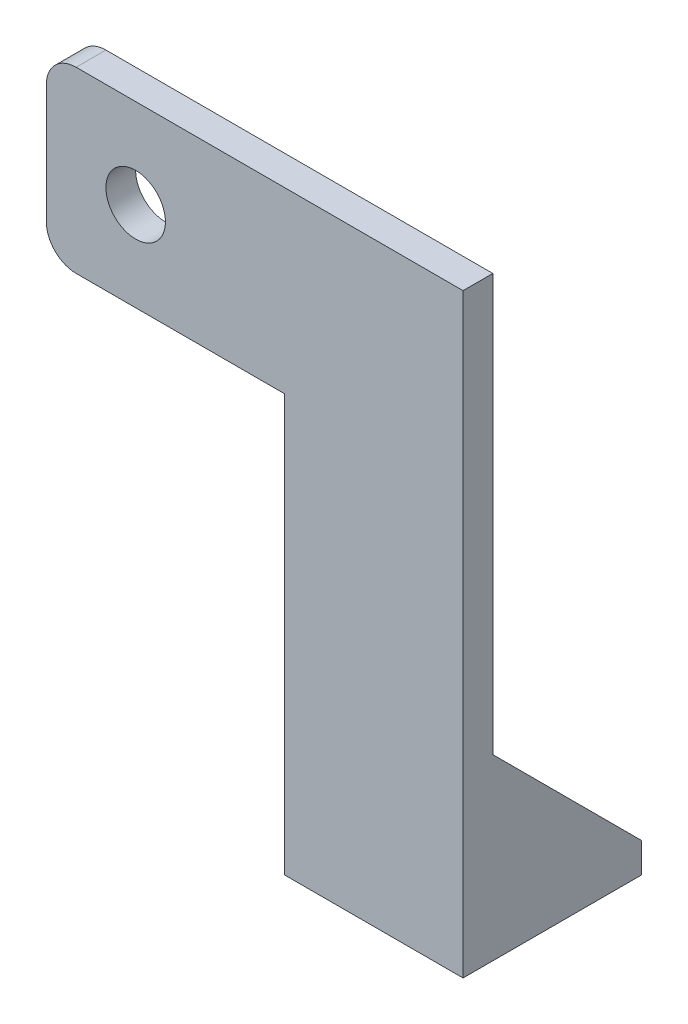
ISO-10303-21;
HEADER;
FILE_DESCRIPTION(('STEP AP214'),'2;1');
FILE_NAME('part.step','',(''),(''),'','','');
FILE_SCHEMA(('AUTOMOTIVE_DESIGN { 1 0 10303 214 1 1 1 1 }'));
ENDSEC;
DATA;
#1=APPLICATION_CONTEXT('core data for automotive mechanical design processes');
#2=APPLICATION_PROTOCOL_DEFINITION('international standard','automotive_design',2000,#1);
#3=PRODUCT_CONTEXT('',#1,'mechanical');
#4=PRODUCT('Part','Part','',(#3));
#5=PRODUCT_RELATED_PRODUCT_CATEGORY('part','',(#4));
#6=PRODUCT_DEFINITION_FORMATION('','',#4);
#7=PRODUCT_DEFINITION_CONTEXT('part definition',#1,'design');
#8=PRODUCT_DEFINITION('design','',#6,#7);
#9=PRODUCT_DEFINITION_SHAPE('','',#8);
#10=(LENGTH_UNIT() NAMED_UNIT(*) SI_UNIT(.MILLI.,.METRE.));
#11=(NAMED_UNIT(*) PLANE_ANGLE_UNIT() SI_UNIT($,.RADIAN.));
#12=(NAMED_UNIT(*) SI_UNIT($,.STERADIAN.) SOLID_ANGLE_UNIT());
#13=UNCERTAINTY_MEASURE_WITH_UNIT(LENGTH_MEASURE(1.E-05),#10,'distance_accuracy_value','');
#14=(GEOMETRIC_REPRESENTATION_CONTEXT(3) GLOBAL_UNCERTAINTY_ASSIGNED_CONTEXT((#13)) GLOBAL_UNIT_ASSIGNED_CONTEXT((#10,
#11,#12)) REPRESENTATION_CONTEXT('',''));
#15=CARTESIAN_POINT('',(0.,0.,0.));
#16=DIRECTION('',(0.,0.,1.));
#17=DIRECTION('',(1.,0.,0.));
#18=AXIS2_PLACEMENT_3D('',#15,#16,#17);
#19=CARTESIAN_POINT('',(0.,-95.,0.));
#20=DIRECTION('',(0.,-1.,0.));
#21=DIRECTION('',(0.,0.,-1.));
#22=AXIS2_PLACEMENT_3D('',#19,#20,#21);
#23=PLANE('',#22);
#24=DIRECTION('',(0.,0.,-1.));
#25=VECTOR('',#24,1.);
#26=CARTESIAN_POINT('',(45.,-95.,0.));
#27=LINE('',#26,#25);
#28=CARTESIAN_POINT('',(45.,-95.,0.));
#29=VERTEX_POINT('',#28);
#30=CARTESIAN_POINT('',(45.,-95.,-25.));
#31=VERTEX_POINT('',#30);
#32=EDGE_CURVE('E275',#29,#31,#27,.T.);
#33=ORIENTED_EDGE('',*,*,#32,.F.);
#34=DIRECTION('',(-1.,0.,0.));
#35=VECTOR('',#34,1.);
#36=CARTESIAN_POINT('',(70.,-95.,0.));
#37=LINE('',#36,#35);
#38=CARTESIAN_POINT('',(65.,-95.,0.));
#39=VERTEX_POINT('',#38);
#40=EDGE_CURVE('E154',#39,#29,#37,.T.);
#41=ORIENTED_EDGE('',*,*,#40,.F.);
#42=DIRECTION('',(0.,0.,-1.));
#43=VECTOR('',#42,1.);
#44=CARTESIAN_POINT('',(65.,-95.,0.));
#45=LINE('',#44,#43);
#46=CARTESIAN_POINT('',(65.,-95.,-25.));
#47=VERTEX_POINT('',#46);
#48=EDGE_CURVE('E268',#39,#47,#45,.T.);
#49=ORIENTED_EDGE('',*,*,#48,.T.);
#50=DIRECTION('',(1.,0.,0.));
#51=VECTOR('',#50,1.);
#52=CARTESIAN_POINT('',(40.,-95.,-25.));
#53=LINE('',#52,#51);
#54=EDGE_CURVE('E232',#31,#47,#53,.T.);
#55=ORIENTED_EDGE('',*,*,#54,.F.);
#56=EDGE_LOOP('',(#33,#41,#49,#55));
#57=FACE_BOUND('',#56,.T.);
#58=ADVANCED_FACE('F36',(#57),#23,.F.);
#59=CARTESIAN_POINT('',(5.,-5.,0.));
#60=DIRECTION('',(0.,0.,1.));
#61=DIRECTION('',(1.,0.,0.));
#62=AXIS2_PLACEMENT_3D('',#59,#60,#61);
#63=PLANE('',#62);
#64=CARTESIAN_POINT('',(15.,-15.,0.));
#65=DIRECTION('',(0.,0.,1.));
#66=DIRECTION('',(1.,0.,0.));
#67=AXIS2_PLACEMENT_3D('',#64,#65,#66);
#68=CIRCLE('',#67,5.);
#69=CARTESIAN_POINT('',(20.,-15.,0.));
#70=VERTEX_POINT('',#69);
#71=EDGE_CURVE('E145',#70,#70,#68,.T.);
#72=ORIENTED_EDGE('',*,*,#71,.T.);
#73=EDGE_LOOP('',(#72));
#74=FACE_BOUND('',#73,.T.);
#75=DIRECTION('',(-1.,0.,0.));
#76=VECTOR('',#75,1.);
#77=CARTESIAN_POINT('',(45.,-70.,0.));
#78=LINE('',#77,#76);
#79=CARTESIAN_POINT('',(45.,-70.,0.));
#80=VERTEX_POINT('',#79);
#81=CARTESIAN_POINT('',(40.,-70.,0.));
#82=VERTEX_POINT('',#81);
#83=EDGE_CURVE('E176',#80,#82,#78,.T.);
#84=ORIENTED_EDGE('',*,*,#83,.T.);
#85=DIRECTION('',(0.,-1.,0.));
#86=VECTOR('',#85,1.);
#87=CARTESIAN_POINT('',(40.,-30.,0.));
#88=LINE('',#87,#86);
#89=CARTESIAN_POINT('',(40.,-30.,0.));
#90=VERTEX_POINT('',#89);
#91=EDGE_CURVE('E152',#90,#82,#88,.T.);
#92=ORIENTED_EDGE('',*,*,#91,.F.);
#93=DIRECTION('',(1.,0.,0.));
#94=VECTOR('',#93,1.);
#95=CARTESIAN_POINT('',(5.,-30.,0.));
#96=LINE('',#95,#94);
#97=CARTESIAN_POINT('',(5.,-30.,0.));
#98=VERTEX_POINT('',#97);
#99=EDGE_CURVE('E121',#98,#90,#96,.T.);
#100=ORIENTED_EDGE('',*,*,#99,.F.);
#101=CARTESIAN_POINT('',(5.,-25.,0.));
#102=DIRECTION('',(0.,0.,-1.));
#103=DIRECTION('',(-1.,0.,0.));
#104=AXIS2_PLACEMENT_3D('',#101,#102,#103);
#105=CIRCLE('',#104,5.);
#106=CARTESIAN_POINT('',(0.,-25.,0.));
#107=VERTEX_POINT('',#106);
#108=EDGE_CURVE('E148',#98,#107,#105,.T.);
#109=ORIENTED_EDGE('',*,*,#108,.T.);
#110=DIRECTION('',(0.,-1.,0.));
#111=VECTOR('',#110,1.);
#112=CARTESIAN_POINT('',(0.,-5.,0.));
#113=LINE('',#112,#111);
#114=CARTESIAN_POINT('',(0.,-5.,0.));
#115=VERTEX_POINT('',#114);
#116=EDGE_CURVE('E144',#115,#107,#113,.T.);
#117=ORIENTED_EDGE('',*,*,#116,.F.);
#118=CARTESIAN_POINT('',(5.,-5.,0.));
#119=DIRECTION('',(0.,0.,1.));
#120=DIRECTION('',(1.,0.,0.));
#121=AXIS2_PLACEMENT_3D('',#118,#119,#120);
#122=CIRCLE('',#121,5.);
#123=CARTESIAN_POINT('',(5.,0.,0.));
#124=VERTEX_POINT('',#123);
#125=EDGE_CURVE('E142',#124,#115,#122,.T.);
#126=ORIENTED_EDGE('',*,*,#125,.F.);
#127=DIRECTION('',(1.,0.,0.));
#128=VECTOR('',#127,1.);
#129=CARTESIAN_POINT('',(5.,0.,0.));
#130=LINE('',#129,#128);
#131=CARTESIAN_POINT('',(70.,0.,0.));
#132=VERTEX_POINT('',#131);
#133=EDGE_CURVE('E160',#124,#132,#130,.T.);
#134=ORIENTED_EDGE('',*,*,#133,.T.);
#135=DIRECTION('',(0.,-1.,0.));
#136=VECTOR('',#135,1.);
#137=CARTESIAN_POINT('',(70.,0.,0.));
#138=LINE('',#137,#136);
#139=CARTESIAN_POINT('',(70.,-70.,0.));
#140=VERTEX_POINT('',#139);
#141=EDGE_CURVE('E157',#132,#140,#138,.T.);
#142=ORIENTED_EDGE('',*,*,#141,.T.);
#143=DIRECTION('',(1.,0.,0.));
#144=VECTOR('',#143,1.);
#145=CARTESIAN_POINT('',(65.,-70.,0.));
#146=LINE('',#145,#144);
#147=CARTESIAN_POINT('',(65.,-70.,0.));
#148=VERTEX_POINT('',#147);
#149=EDGE_CURVE('E246',#148,#140,#146,.T.);
#150=ORIENTED_EDGE('',*,*,#149,.F.);
#151=DIRECTION('',(0.,-1.,0.));
#152=VECTOR('',#151,1.);
#153=CARTESIAN_POINT('',(65.,-70.,0.));
#154=LINE('',#153,#152);
#155=EDGE_CURVE('E247',#148,#39,#154,.T.);
#156=ORIENTED_EDGE('',*,*,#155,.T.);
#157=ORIENTED_EDGE('',*,*,#40,.T.);
#158=DIRECTION('',(0.,-1.,0.));
#159=VECTOR('',#158,1.);
#160=CARTESIAN_POINT('',(45.,-70.,0.));
#161=LINE('',#160,#159);
#162=EDGE_CURVE('E277',#80,#29,#161,.T.);
#163=ORIENTED_EDGE('',*,*,#162,.F.);
#164=EDGE_LOOP('',(#84,#92,#100,#109,#117,#126,#134,#142,#150,#156,#157,#163));
#165=FACE_BOUND('',#164,.T.);
#166=ADVANCED_FACE('F173',(#74,#165),#63,.F.);
#167=CARTESIAN_POINT('',(5.,-5.,5.));
#168=DIRECTION('',(0.,0.,-1.));
#169=DIRECTION('',(-1.,0.,0.));
#170=AXIS2_PLACEMENT_3D('',#167,#168,#169);
#171=CYLINDRICAL_SURFACE('',#170,5.);
#172=ORIENTED_EDGE('',*,*,#125,.T.);
#173=DIRECTION('',(0.,0.,-1.));
#174=VECTOR('',#173,1.);
#175=CARTESIAN_POINT('',(0.,-5.,5.));
#176=LINE('',#175,#174);
#177=CARTESIAN_POINT('',(0.,-5.,5.));
#178=VERTEX_POINT('',#177);
#179=EDGE_CURVE('E11',#178,#115,#176,.T.);
#180=ORIENTED_EDGE('',*,*,#179,.F.);
#181=CARTESIAN_POINT('',(5.,-5.,5.));
#182=DIRECTION('',(0.,0.,1.));
#183=DIRECTION('',(1.,0.,0.));
#184=AXIS2_PLACEMENT_3D('',#181,#182,#183);
#185=CIRCLE('',#184,5.);
#186=CARTESIAN_POINT('',(5.,0.,5.));
#187=VERTEX_POINT('',#186);
#188=EDGE_CURVE('E163',#187,#178,#185,.T.);
#189=ORIENTED_EDGE('',*,*,#188,.F.);
#190=DIRECTION('',(0.,0.,-1.));
#191=VECTOR('',#190,1.);
#192=CARTESIAN_POINT('',(5.,0.,5.));
#193=LINE('',#192,#191);
#194=EDGE_CURVE('E60',#187,#124,#193,.T.);
#195=ORIENTED_EDGE('',*,*,#194,.T.);
#196=EDGE_LOOP('',(#172,#180,#189,#195));
#197=FACE_BOUND('',#196,.T.);
#198=ADVANCED_FACE('F38',(#197),#171,.T.);
#199=CARTESIAN_POINT('',(0.,-5.,5.));
#200=DIRECTION('',(1.,0.,0.));
#201=DIRECTION('',(0.,0.,-1.));
#202=AXIS2_PLACEMENT_3D('',#199,#200,#201);
#203=PLANE('',#202);
#204=ORIENTED_EDGE('',*,*,#116,.T.);
#205=DIRECTION('',(0.,0.,-1.));
#206=VECTOR('',#205,1.);
#207=CARTESIAN_POINT('',(0.,-25.,5.));
#208=LINE('',#207,#206);
#209=CARTESIAN_POINT('',(0.,-25.,5.));
#210=VERTEX_POINT('',#209);
#211=EDGE_CURVE('E44',#210,#107,#208,.T.);
#212=ORIENTED_EDGE('',*,*,#211,.F.);
#213=DIRECTION('',(0.,-1.,0.));
#214=VECTOR('',#213,1.);
#215=CARTESIAN_POINT('',(0.,-5.,5.));
#216=LINE('',#215,#214);
#217=EDGE_CURVE('E93',#178,#210,#216,.T.);
#218=ORIENTED_EDGE('',*,*,#217,.F.);
#219=ORIENTED_EDGE('',*,*,#179,.T.);
#220=EDGE_LOOP('',(#204,#212,#218,#219));
#221=FACE_BOUND('',#220,.T.);
#222=ADVANCED_FACE('F169',(#221),#203,.F.);
#223=CARTESIAN_POINT('',(5.,-25.,5.));
#224=DIRECTION('',(0.,0.,-1.));
#225=DIRECTION('',(-1.,0.,0.));
#226=AXIS2_PLACEMENT_3D('',#223,#224,#225);
#227=CYLINDRICAL_SURFACE('',#226,5.);
#228=ORIENTED_EDGE('',*,*,#108,.F.);
#229=DIRECTION('',(0.,0.,-1.));
#230=VECTOR('',#229,1.);
#231=CARTESIAN_POINT('',(5.,-30.,5.));
#232=LINE('',#231,#230);
#233=CARTESIAN_POINT('',(5.,-30.,5.));
#234=VERTEX_POINT('',#233);
#235=EDGE_CURVE('E125',#234,#98,#232,.T.);
#236=ORIENTED_EDGE('',*,*,#235,.F.);
#237=CARTESIAN_POINT('',(5.,-25.,5.));
#238=DIRECTION('',(0.,0.,-1.));
#239=DIRECTION('',(-1.,0.,0.));
#240=AXIS2_PLACEMENT_3D('',#237,#238,#239);
#241=CIRCLE('',#240,5.);
#242=EDGE_CURVE('E114',#234,#210,#241,.T.);
#243=ORIENTED_EDGE('',*,*,#242,.T.);
#244=ORIENTED_EDGE('',*,*,#211,.T.);
#245=EDGE_LOOP('',(#228,#236,#243,#244));
#246=FACE_BOUND('',#245,.T.);
#247=ADVANCED_FACE('F168',(#246),#227,.T.);
#248=CARTESIAN_POINT('',(5.,-30.,5.));
#249=DIRECTION('',(0.,1.,0.));
#250=DIRECTION('',(0.,0.,1.));
#251=AXIS2_PLACEMENT_3D('',#248,#249,#250);
#252=PLANE('',#251);
#253=ORIENTED_EDGE('',*,*,#99,.T.);
#254=DIRECTION('',(0.,0.,-1.));
#255=VECTOR('',#254,1.);
#256=CARTESIAN_POINT('',(40.,-30.,5.));
#257=LINE('',#256,#255);
#258=CARTESIAN_POINT('',(40.,-30.,5.));
#259=VERTEX_POINT('',#258);
#260=EDGE_CURVE('E118',#259,#90,#257,.T.);
#261=ORIENTED_EDGE('',*,*,#260,.F.);
#262=DIRECTION('',(1.,0.,0.));
#263=VECTOR('',#262,1.);
#264=CARTESIAN_POINT('',(5.,-30.,5.));
#265=LINE('',#264,#263);
#266=EDGE_CURVE('E106',#234,#259,#265,.T.);
#267=ORIENTED_EDGE('',*,*,#266,.F.);
#268=ORIENTED_EDGE('',*,*,#235,.T.);
#269=EDGE_LOOP('',(#253,#261,#267,#268));
#270=FACE_BOUND('',#269,.T.);
#271=ADVANCED_FACE('F119',(#270),#252,.F.);
#272=CARTESIAN_POINT('',(40.,-30.,5.));
#273=DIRECTION('',(1.,0.,0.));
#274=DIRECTION('',(0.,1.,0.));
#275=AXIS2_PLACEMENT_3D('',#272,#273,#274);
#276=PLANE('',#275);
#277=DIRECTION('',(0.,0.707106781186547,0.707106781186548));
#278=VECTOR('',#277,1.);
#279=CARTESIAN_POINT('',(40.,-70.,0.));
#280=LINE('',#279,#278);
#281=CARTESIAN_POINT('',(40.,-95.,-25.));
#282=VERTEX_POINT('',#281);
#283=EDGE_CURVE('E179',#282,#82,#280,.T.);
#284=ORIENTED_EDGE('',*,*,#283,.F.);
#285=DIRECTION('',(0.,1.,0.));
#286=VECTOR('',#285,1.);
#287=CARTESIAN_POINT('',(40.,-100.,-25.));
#288=LINE('',#287,#286);
#289=CARTESIAN_POINT('',(40.,-100.,-25.));
#290=VERTEX_POINT('',#289);
#291=EDGE_CURVE('E226',#290,#282,#288,.T.);
#292=ORIENTED_EDGE('',*,*,#291,.F.);
#293=DIRECTION('',(0.,0.,-1.));
#294=VECTOR('',#293,1.);
#295=CARTESIAN_POINT('',(40.,-100.,5.));
#296=LINE('',#295,#294);
#297=CARTESIAN_POINT('',(40.,-100.,5.));
#298=VERTEX_POINT('',#297);
#299=EDGE_CURVE('E133',#298,#290,#296,.T.);
#300=ORIENTED_EDGE('',*,*,#299,.F.);
#301=DIRECTION('',(0.,-1.,0.));
#302=VECTOR('',#301,1.);
#303=CARTESIAN_POINT('',(40.,-30.,5.));
#304=LINE('',#303,#302);
#305=EDGE_CURVE('E111',#259,#298,#304,.T.);
#306=ORIENTED_EDGE('',*,*,#305,.F.);
#307=ORIENTED_EDGE('',*,*,#260,.T.);
#308=ORIENTED_EDGE('',*,*,#91,.T.);
#309=EDGE_LOOP('',(#284,#292,#300,#306,#307,#308));
#310=FACE_BOUND('',#309,.T.);
#311=ADVANCED_FACE('F130',(#310),#276,.F.);
#312=CARTESIAN_POINT('',(70.,0.,5.));
#313=DIRECTION('',(1.,0.,0.));
#314=DIRECTION('',(0.,0.,-1.));
#315=AXIS2_PLACEMENT_3D('',#312,#313,#314);
#316=PLANE('',#315);
#317=ORIENTED_EDGE('',*,*,#141,.F.);
#318=DIRECTION('',(0.,0.,-1.));
#319=VECTOR('',#318,1.);
#320=CARTESIAN_POINT('',(70.,0.,5.));
#321=LINE('',#320,#319);
#322=CARTESIAN_POINT('',(70.,0.,5.));
#323=VERTEX_POINT('',#322);
#324=EDGE_CURVE('E126',#323,#132,#321,.T.);
#325=ORIENTED_EDGE('',*,*,#324,.F.);
#326=DIRECTION('',(0.,-1.,0.));
#327=VECTOR('',#326,1.);
#328=CARTESIAN_POINT('',(70.,-30.,5.));
#329=LINE('',#328,#327);
#330=CARTESIAN_POINT('',(70.,-100.,5.));
#331=VERTEX_POINT('',#330);
#332=EDGE_CURVE('E134',#323,#331,#329,.T.);
#333=ORIENTED_EDGE('',*,*,#332,.T.);
#334=DIRECTION('',(0.,0.,1.));
#335=VECTOR('',#334,1.);
#336=CARTESIAN_POINT('',(70.,-100.,5.));
#337=LINE('',#336,#335);
#338=CARTESIAN_POINT('',(70.,-100.,-25.));
#339=VERTEX_POINT('',#338);
#340=EDGE_CURVE('E216',#339,#331,#337,.T.);
#341=ORIENTED_EDGE('',*,*,#340,.F.);
#342=DIRECTION('',(0.,1.,0.));
#343=VECTOR('',#342,1.);
#344=CARTESIAN_POINT('',(70.,-100.,-25.));
#345=LINE('',#344,#343);
#346=CARTESIAN_POINT('',(70.,-95.,-25.));
#347=VERTEX_POINT('',#346);
#348=EDGE_CURVE('E224',#339,#347,#345,.T.);
#349=ORIENTED_EDGE('',*,*,#348,.T.);
#350=DIRECTION('',(0.,0.707106781186547,0.707106781186548));
#351=VECTOR('',#350,1.);
#352=CARTESIAN_POINT('',(70.,-70.,0.));
#353=LINE('',#352,#351);
#354=EDGE_CURVE('E243',#347,#140,#353,.T.);
#355=ORIENTED_EDGE('',*,*,#354,.T.);
#356=EDGE_LOOP('',(#317,#325,#333,#341,#349,#355));
#357=FACE_BOUND('',#356,.T.);
#358=ADVANCED_FACE('F214',(#357),#316,.T.);
#359=CARTESIAN_POINT('',(5.,0.,5.));
#360=DIRECTION('',(0.,1.,0.));
#361=DIRECTION('',(0.,0.,1.));
#362=AXIS2_PLACEMENT_3D('',#359,#360,#361);
#363=PLANE('',#362);
#364=ORIENTED_EDGE('',*,*,#133,.F.);
#365=ORIENTED_EDGE('',*,*,#194,.F.);
#366=DIRECTION('',(1.,0.,0.));
#367=VECTOR('',#366,1.);
#368=CARTESIAN_POINT('',(5.,0.,5.));
#369=LINE('',#368,#367);
#370=EDGE_CURVE('E137',#187,#323,#369,.T.);
#371=ORIENTED_EDGE('',*,*,#370,.T.);
#372=ORIENTED_EDGE('',*,*,#324,.T.);
#373=EDGE_LOOP('',(#364,#365,#371,#372));
#374=FACE_BOUND('',#373,.T.);
#375=ADVANCED_FACE('F241',(#374),#363,.T.);
#376=CARTESIAN_POINT('',(5.,-5.,5.));
#377=DIRECTION('',(0.,0.,1.));
#378=DIRECTION('',(1.,0.,0.));
#379=AXIS2_PLACEMENT_3D('',#376,#377,#378);
#380=PLANE('',#379);
#381=CARTESIAN_POINT('',(15.,-15.,5.));
#382=DIRECTION('',(0.,0.,1.));
#383=DIRECTION('',(1.,0.,0.));
#384=AXIS2_PLACEMENT_3D('',#381,#382,#383);
#385=CIRCLE('',#384,5.);
#386=CARTESIAN_POINT('',(20.,-15.,5.));
#387=VERTEX_POINT('',#386);
#388=EDGE_CURVE('E235',#387,#387,#385,.T.);
#389=ORIENTED_EDGE('',*,*,#388,.F.);
#390=EDGE_LOOP('',(#389));
#391=FACE_BOUND('',#390,.T.);
#392=ORIENTED_EDGE('',*,*,#188,.T.);
#393=ORIENTED_EDGE('',*,*,#217,.T.);
#394=ORIENTED_EDGE('',*,*,#242,.F.);
#395=ORIENTED_EDGE('',*,*,#266,.T.);
#396=ORIENTED_EDGE('',*,*,#305,.T.);
#397=DIRECTION('',(-1.,0.,0.));
#398=VECTOR('',#397,1.);
#399=CARTESIAN_POINT('',(40.,-100.,5.));
#400=LINE('',#399,#398);
#401=EDGE_CURVE('E220',#331,#298,#400,.T.);
#402=ORIENTED_EDGE('',*,*,#401,.F.);
#403=ORIENTED_EDGE('',*,*,#332,.F.);
#404=ORIENTED_EDGE('',*,*,#370,.F.);
#405=EDGE_LOOP('',(#392,#393,#394,#395,#396,#402,#403,#404));
#406=FACE_BOUND('',#405,.T.);
#407=ADVANCED_FACE('F108',(#391,#406),#380,.T.);
#408=CARTESIAN_POINT('',(15.,-15.,0.));
#409=DIRECTION('',(0.,0.,1.));
#410=DIRECTION('',(1.,0.,0.));
#411=AXIS2_PLACEMENT_3D('',#408,#409,#410);
#412=CYLINDRICAL_SURFACE('',#411,5.);
#413=ORIENTED_EDGE('',*,*,#71,.F.);
#414=EDGE_LOOP('',(#413));
#415=FACE_BOUND('',#414,.T.);
#416=ORIENTED_EDGE('',*,*,#388,.T.);
#417=EDGE_LOOP('',(#416));
#418=FACE_BOUND('',#417,.T.);
#419=ADVANCED_FACE('F304',(#415,#418),#412,.F.);
#420=CARTESIAN_POINT('',(40.,-100.,-25.));
#421=DIRECTION('',(0.,0.,1.));
#422=DIRECTION('',(1.,0.,0.));
#423=AXIS2_PLACEMENT_3D('',#420,#421,#422);
#424=PLANE('',#423);
#425=EDGE_CURVE('E230',#282,#31,#53,.T.);
#426=ORIENTED_EDGE('',*,*,#425,.T.);
#427=ORIENTED_EDGE('',*,*,#54,.T.);
#428=DIRECTION('',(1.,0.,0.));
#429=VECTOR('',#428,1.);
#430=CARTESIAN_POINT('',(65.,-95.,-25.));
#431=LINE('',#430,#429);
#432=EDGE_CURVE('E251',#47,#347,#431,.T.);
#433=ORIENTED_EDGE('',*,*,#432,.T.);
#434=ORIENTED_EDGE('',*,*,#348,.F.);
#435=DIRECTION('',(1.,0.,0.));
#436=VECTOR('',#435,1.);
#437=CARTESIAN_POINT('',(40.,-100.,-25.));
#438=LINE('',#437,#436);
#439=EDGE_CURVE('E221',#290,#339,#438,.T.);
#440=ORIENTED_EDGE('',*,*,#439,.F.);
#441=ORIENTED_EDGE('',*,*,#291,.T.);
#442=EDGE_LOOP('',(#426,#427,#433,#434,#440,#441));
#443=FACE_BOUND('',#442,.T.);
#444=ADVANCED_FACE('F260',(#443),#424,.F.);
#445=CARTESIAN_POINT('',(0.,-100.,0.));
#446=DIRECTION('',(0.,-1.,0.));
#447=DIRECTION('',(0.,0.,-1.));
#448=AXIS2_PLACEMENT_3D('',#445,#446,#447);
#449=PLANE('',#448);
#450=ORIENTED_EDGE('',*,*,#299,.T.);
#451=ORIENTED_EDGE('',*,*,#439,.T.);
#452=ORIENTED_EDGE('',*,*,#340,.T.);
#453=ORIENTED_EDGE('',*,*,#401,.T.);
#454=EDGE_LOOP('',(#450,#451,#452,#453));
#455=FACE_BOUND('',#454,.T.);
#456=ADVANCED_FACE('F219',(#455),#449,.T.);
#457=CARTESIAN_POINT('',(65.,-70.,0.));
#458=DIRECTION('',(0.,0.707106781186548,-0.707106781186547));
#459=DIRECTION('',(0.,0.707106781186547,0.707106781186548));
#460=AXIS2_PLACEMENT_3D('',#457,#458,#459);
#461=PLANE('',#460);
#462=ORIENTED_EDGE('',*,*,#354,.F.);
#463=ORIENTED_EDGE('',*,*,#432,.F.);
#464=DIRECTION('',(0.,0.707106781186547,0.707106781186548));
#465=VECTOR('',#464,1.);
#466=CARTESIAN_POINT('',(65.,-70.,0.));
#467=LINE('',#466,#465);
#468=EDGE_CURVE('E254',#47,#148,#467,.T.);
#469=ORIENTED_EDGE('',*,*,#468,.T.);
#470=ORIENTED_EDGE('',*,*,#149,.T.);
#471=EDGE_LOOP('',(#462,#463,#469,#470));
#472=FACE_BOUND('',#471,.T.);
#473=ADVANCED_FACE('F264',(#472),#461,.T.);
#474=CARTESIAN_POINT('',(65.,0.,0.));
#475=DIRECTION('',(1.,0.,0.));
#476=DIRECTION('',(0.,0.,-1.));
#477=AXIS2_PLACEMENT_3D('',#474,#475,#476);
#478=PLANE('',#477);
#479=ORIENTED_EDGE('',*,*,#155,.F.);
#480=ORIENTED_EDGE('',*,*,#468,.F.);
#481=ORIENTED_EDGE('',*,*,#48,.F.);
#482=EDGE_LOOP('',(#479,#480,#481));
#483=FACE_BOUND('',#482,.T.);
#484=ADVANCED_FACE('F267',(#483),#478,.F.);
#485=CARTESIAN_POINT('',(45.,-70.,0.));
#486=DIRECTION('',(0.,-0.707106781186548,0.707106781186547));
#487=DIRECTION('',(0.,-0.707106781186547,-0.707106781186548));
#488=AXIS2_PLACEMENT_3D('',#485,#486,#487);
#489=PLANE('',#488);
#490=ORIENTED_EDGE('',*,*,#283,.T.);
#491=ORIENTED_EDGE('',*,*,#83,.F.);
#492=DIRECTION('',(0.,0.707106781186547,0.707106781186548));
#493=VECTOR('',#492,1.);
#494=CARTESIAN_POINT('',(45.,-70.,0.));
#495=LINE('',#494,#493);
#496=EDGE_CURVE('E51',#31,#80,#495,.T.);
#497=ORIENTED_EDGE('',*,*,#496,.F.);
#498=ORIENTED_EDGE('',*,*,#425,.F.);
#499=EDGE_LOOP('',(#490,#491,#497,#498));
#500=FACE_BOUND('',#499,.T.);
#501=ADVANCED_FACE('F283',(#500),#489,.F.);
#502=CARTESIAN_POINT('',(45.,0.,0.));
#503=DIRECTION('',(-1.,0.,0.));
#504=DIRECTION('',(0.,0.,-1.));
#505=AXIS2_PLACEMENT_3D('',#502,#503,#504);
#506=PLANE('',#505);
#507=ORIENTED_EDGE('',*,*,#162,.T.);
#508=ORIENTED_EDGE('',*,*,#32,.T.);
#509=ORIENTED_EDGE('',*,*,#496,.T.);
#510=EDGE_LOOP('',(#507,#508,#509));
#511=FACE_BOUND('',#510,.T.);
#512=ADVANCED_FACE('F282',(#511),#506,.F.);
#513=CLOSED_SHELL('',(#58,#166,#198,#222,#247,#271,#311,#358,#375,#407,#419,#444,#456,#473,#484,
#501,#512));
#514=MANIFOLD_SOLID_BREP('B2',#513);
#515=ADVANCED_BREP_SHAPE_REPRESENTATION('',(#18,#514),#14);
#516=SHAPE_DEFINITION_REPRESENTATION(#9,#515);
ENDSEC;
END-ISO-10303-21;
